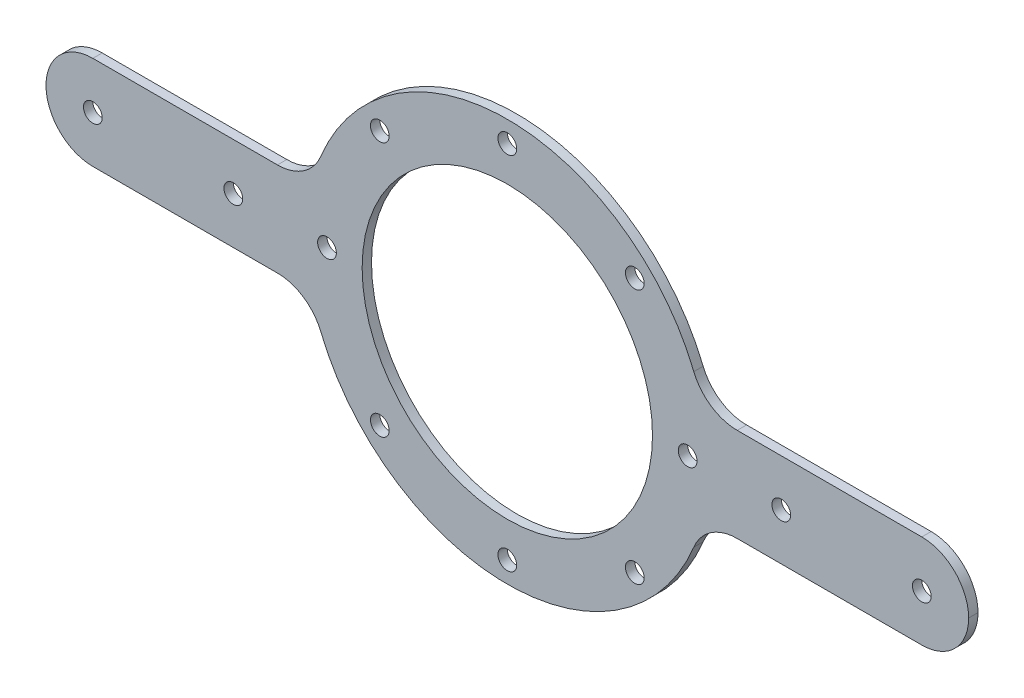
ISO-10303-21;
HEADER;
FILE_DESCRIPTION(('STEP AP214'),'2;1');
FILE_NAME('part.step','',(''),(''),'','','');
FILE_SCHEMA(('AUTOMOTIVE_DESIGN { 1 0 10303 214 1 1 1 1 }'));
ENDSEC;
DATA;
#1=APPLICATION_CONTEXT('core data for automotive mechanical design processes');
#2=APPLICATION_PROTOCOL_DEFINITION('international standard','automotive_design',2000,#1);
#3=PRODUCT_CONTEXT('',#1,'mechanical');
#4=PRODUCT('Part','Part','',(#3));
#5=PRODUCT_RELATED_PRODUCT_CATEGORY('part','',(#4));
#6=PRODUCT_DEFINITION_FORMATION('','',#4);
#7=PRODUCT_DEFINITION_CONTEXT('part definition',#1,'design');
#8=PRODUCT_DEFINITION('design','',#6,#7);
#9=PRODUCT_DEFINITION_SHAPE('','',#8);
#10=(LENGTH_UNIT() NAMED_UNIT(*) SI_UNIT(.MILLI.,.METRE.));
#11=(NAMED_UNIT(*) PLANE_ANGLE_UNIT() SI_UNIT($,.RADIAN.));
#12=(NAMED_UNIT(*) SI_UNIT($,.STERADIAN.) SOLID_ANGLE_UNIT());
#13=UNCERTAINTY_MEASURE_WITH_UNIT(LENGTH_MEASURE(1.E-05),#10,'distance_accuracy_value','');
#14=(GEOMETRIC_REPRESENTATION_CONTEXT(3) GLOBAL_UNCERTAINTY_ASSIGNED_CONTEXT((#13)) GLOBAL_UNIT_ASSIGNED_CONTEXT((#10,
#11,#12)) REPRESENTATION_CONTEXT('',''));
#15=CARTESIAN_POINT('',(0.,0.,0.));
#16=DIRECTION('',(0.,0.,1.));
#17=DIRECTION('',(1.,0.,0.));
#18=AXIS2_PLACEMENT_3D('',#15,#16,#17);
#19=CARTESIAN_POINT('',(0.,0.,1.));
#20=DIRECTION('',(0.,0.,1.));
#21=DIRECTION('',(1.,0.,0.));
#22=AXIS2_PLACEMENT_3D('',#19,#20,#21);
#23=PLANE('',#22);
#24=CARTESIAN_POINT('',(58.5,0.,1.));
#25=DIRECTION('',(0.,0.,1.));
#26=DIRECTION('',(1.,0.,0.));
#27=AXIS2_PLACEMENT_3D('',#24,#25,#26);
#28=CIRCLE('',#27,2.);
#29=CARTESIAN_POINT('',(60.5,0.,1.));
#30=VERTEX_POINT('',#29);
#31=EDGE_CURVE('E680',#30,#30,#28,.T.);
#32=ORIENTED_EDGE('',*,*,#31,.F.);
#33=EDGE_LOOP('',(#32));
#34=FACE_BOUND('',#33,.T.);
#35=CARTESIAN_POINT('',(-27.2236110756821,27.2236110756821,1.));
#36=DIRECTION('',(0.,0.,1.));
#37=DIRECTION('',(1.,0.,0.));
#38=AXIS2_PLACEMENT_3D('',#35,#36,#37);
#39=CIRCLE('',#38,2.00000000000001);
#40=CARTESIAN_POINT('',(-25.2236110756821,27.2236110756821,1.));
#41=VERTEX_POINT('',#40);
#42=EDGE_CURVE('E695',#41,#41,#39,.T.);
#43=ORIENTED_EDGE('',*,*,#42,.F.);
#44=EDGE_LOOP('',(#43));
#45=FACE_BOUND('',#44,.T.);
#46=CARTESIAN_POINT('',(-27.2236110756821,-27.2236110756821,1.));
#47=DIRECTION('',(0.,0.,1.));
#48=DIRECTION('',(1.,0.,0.));
#49=AXIS2_PLACEMENT_3D('',#46,#47,#48);
#50=CIRCLE('',#49,2.00000000000001);
#51=CARTESIAN_POINT('',(-25.2236110756821,-27.2236110756821,1.));
#52=VERTEX_POINT('',#51);
#53=EDGE_CURVE('E711',#52,#52,#50,.T.);
#54=ORIENTED_EDGE('',*,*,#53,.F.);
#55=EDGE_LOOP('',(#54));
#56=FACE_BOUND('',#55,.T.);
#57=CARTESIAN_POINT('',(27.2236110756821,-27.2236110756821,1.));
#58=DIRECTION('',(0.,0.,1.));
#59=DIRECTION('',(1.,0.,0.));
#60=AXIS2_PLACEMENT_3D('',#57,#58,#59);
#61=CIRCLE('',#60,2.);
#62=CARTESIAN_POINT('',(29.2236110756821,-27.2236110756821,1.));
#63=VERTEX_POINT('',#62);
#64=EDGE_CURVE('E727',#63,#63,#61,.T.);
#65=ORIENTED_EDGE('',*,*,#64,.F.);
#66=EDGE_LOOP('',(#65));
#67=FACE_BOUND('',#66,.T.);
#68=CARTESIAN_POINT('',(27.2236110756821,27.2236110756821,1.));
#69=DIRECTION('',(0.,0.,1.));
#70=DIRECTION('',(1.,0.,0.));
#71=AXIS2_PLACEMENT_3D('',#68,#69,#70);
#72=CIRCLE('',#71,2.);
#73=CARTESIAN_POINT('',(29.2236110756821,27.2236110756821,1.));
#74=VERTEX_POINT('',#73);
#75=EDGE_CURVE('E743',#74,#74,#72,.T.);
#76=ORIENTED_EDGE('',*,*,#75,.F.);
#77=EDGE_LOOP('',(#76));
#78=FACE_BOUND('',#77,.T.);
#79=CARTESIAN_POINT('',(-58.5,0.,1.));
#80=DIRECTION('',(0.,0.,1.));
#81=DIRECTION('',(1.,0.,0.));
#82=AXIS2_PLACEMENT_3D('',#79,#80,#81);
#83=CIRCLE('',#82,2.);
#84=CARTESIAN_POINT('',(-56.5,0.,1.));
#85=VERTEX_POINT('',#84);
#86=EDGE_CURVE('E759',#85,#85,#83,.T.);
#87=ORIENTED_EDGE('',*,*,#86,.F.);
#88=EDGE_LOOP('',(#87));
#89=FACE_BOUND('',#88,.T.);
#90=DIRECTION('',(1.,0.,0.));
#91=VECTOR('',#90,1.);
#92=CARTESIAN_POINT('',(98.5,-9.99999999999993,1.));
#93=LINE('',#92,#91);
#94=CARTESIAN_POINT('',(49.0815647672321,-10.,1.));
#95=VERTEX_POINT('',#94);
#96=CARTESIAN_POINT('',(88.5,-9.99999999999995,1.));
#97=VERTEX_POINT('',#96);
#98=EDGE_CURVE('E321',#95,#97,#93,.T.);
#99=ORIENTED_EDGE('',*,*,#98,.T.);
#100=CARTESIAN_POINT('',(88.5,0.,1.));
#101=DIRECTION('',(0.,0.,1.));
#102=DIRECTION('',(1.,0.,0.));
#103=AXIS2_PLACEMENT_3D('',#100,#101,#102);
#104=CIRCLE('',#103,10.);
#105=CARTESIAN_POINT('',(98.5,0.,1.));
#106=VERTEX_POINT('',#105);
#107=EDGE_CURVE('E230',#97,#106,#104,.T.);
#108=ORIENTED_EDGE('',*,*,#107,.T.);
#109=CARTESIAN_POINT('',(88.5,0.,1.));
#110=DIRECTION('',(0.,0.,1.));
#111=DIRECTION('',(1.,0.,0.));
#112=AXIS2_PLACEMENT_3D('',#109,#110,#111);
#113=CIRCLE('',#112,10.);
#114=CARTESIAN_POINT('',(88.5,10.,1.));
#115=VERTEX_POINT('',#114);
#116=EDGE_CURVE('E67',#106,#115,#113,.T.);
#117=ORIENTED_EDGE('',*,*,#116,.T.);
#118=DIRECTION('',(-1.,0.,0.));
#119=VECTOR('',#118,1.);
#120=CARTESIAN_POINT('',(41.821047332653,10.0000000000001,1.));
#121=LINE('',#120,#119);
#122=CARTESIAN_POINT('',(49.0815647672321,10.0000000000001,1.));
#123=VERTEX_POINT('',#122);
#124=EDGE_CURVE('E185',#115,#123,#121,.T.);
#125=ORIENTED_EDGE('',*,*,#124,.T.);
#126=CARTESIAN_POINT('',(49.0815647672321,20.0000000000001,1.));
#127=DIRECTION('',(0.,0.,1.));
#128=DIRECTION('',(1.,0.,0.));
#129=AXIS2_PLACEMENT_3D('',#126,#127,#128);
#130=CIRCLE('',#129,10.);
#131=CARTESIAN_POINT('',(39.8208921696411,16.2264150943397,1.));
#132=VERTEX_POINT('',#131);
#133=EDGE_CURVE('E154',#123,#132,#130,.F.);
#134=ORIENTED_EDGE('',*,*,#133,.T.);
#135=CARTESIAN_POINT('',(0.,0.,1.));
#136=DIRECTION('',(0.,0.,1.));
#137=DIRECTION('',(1.,0.,0.));
#138=AXIS2_PLACEMENT_3D('',#135,#136,#137);
#139=CIRCLE('',#138,43.);
#140=CARTESIAN_POINT('',(-39.8208921696411,16.2264150943396,1.));
#141=VERTEX_POINT('',#140);
#142=EDGE_CURVE('E164',#132,#141,#139,.T.);
#143=ORIENTED_EDGE('',*,*,#142,.T.);
#144=CARTESIAN_POINT('',(-49.0815647672321,20.,1.));
#145=DIRECTION('',(0.,0.,1.));
#146=DIRECTION('',(1.,0.,0.));
#147=AXIS2_PLACEMENT_3D('',#144,#145,#146);
#148=CIRCLE('',#147,10.);
#149=CARTESIAN_POINT('',(-49.0815647672321,10.,1.));
#150=VERTEX_POINT('',#149);
#151=EDGE_CURVE('E11',#141,#150,#148,.F.);
#152=ORIENTED_EDGE('',*,*,#151,.T.);
#153=DIRECTION('',(-1.,0.,0.));
#154=VECTOR('',#153,1.);
#155=CARTESIAN_POINT('',(-41.821047332653,10.,1.));
#156=LINE('',#155,#154);
#157=CARTESIAN_POINT('',(-88.5,9.99999999999998,1.));
#158=VERTEX_POINT('',#157);
#159=EDGE_CURVE('E303',#150,#158,#156,.T.);
#160=ORIENTED_EDGE('',*,*,#159,.T.);
#161=CARTESIAN_POINT('',(-88.5,0.,1.));
#162=DIRECTION('',(0.,0.,1.));
#163=DIRECTION('',(1.,0.,0.));
#164=AXIS2_PLACEMENT_3D('',#161,#162,#163);
#165=CIRCLE('',#164,10.);
#166=CARTESIAN_POINT('',(-98.5,0.,1.));
#167=VERTEX_POINT('',#166);
#168=EDGE_CURVE('E222',#158,#167,#165,.T.);
#169=ORIENTED_EDGE('',*,*,#168,.T.);
#170=CARTESIAN_POINT('',(-88.5,0.,1.));
#171=DIRECTION('',(0.,0.,1.));
#172=DIRECTION('',(1.,0.,0.));
#173=AXIS2_PLACEMENT_3D('',#170,#171,#172);
#174=CIRCLE('',#173,10.);
#175=CARTESIAN_POINT('',(-88.5,-10.,1.));
#176=VERTEX_POINT('',#175);
#177=EDGE_CURVE('E225',#167,#176,#174,.T.);
#178=ORIENTED_EDGE('',*,*,#177,.T.);
#179=DIRECTION('',(1.,0.,0.));
#180=VECTOR('',#179,1.);
#181=CARTESIAN_POINT('',(-98.5,-10.,1.));
#182=LINE('',#181,#180);
#183=CARTESIAN_POINT('',(-49.0815647672321,-10.,1.));
#184=VERTEX_POINT('',#183);
#185=EDGE_CURVE('E311',#176,#184,#182,.T.);
#186=ORIENTED_EDGE('',*,*,#185,.T.);
#187=CARTESIAN_POINT('',(-49.0815647672321,-20.,1.));
#188=DIRECTION('',(0.,0.,1.));
#189=DIRECTION('',(1.,0.,0.));
#190=AXIS2_PLACEMENT_3D('',#187,#188,#189);
#191=CIRCLE('',#190,10.);
#192=CARTESIAN_POINT('',(-39.8208921696411,-16.2264150943396,1.));
#193=VERTEX_POINT('',#192);
#194=EDGE_CURVE('E270',#184,#193,#191,.F.);
#195=ORIENTED_EDGE('',*,*,#194,.T.);
#196=CARTESIAN_POINT('',(0.,0.,1.));
#197=DIRECTION('',(0.,0.,1.));
#198=DIRECTION('',(1.,0.,0.));
#199=AXIS2_PLACEMENT_3D('',#196,#197,#198);
#200=CIRCLE('',#199,43.);
#201=CARTESIAN_POINT('',(39.8208921696411,-16.2264150943396,1.));
#202=VERTEX_POINT('',#201);
#203=EDGE_CURVE('E318',#193,#202,#200,.T.);
#204=ORIENTED_EDGE('',*,*,#203,.T.);
#205=CARTESIAN_POINT('',(49.0815647672321,-20.,1.));
#206=DIRECTION('',(0.,0.,1.));
#207=DIRECTION('',(1.,0.,0.));
#208=AXIS2_PLACEMENT_3D('',#205,#206,#207);
#209=CIRCLE('',#208,10.);
#210=EDGE_CURVE('E155',#202,#95,#209,.F.);
#211=ORIENTED_EDGE('',*,*,#210,.T.);
#212=EDGE_LOOP('',(#99,#108,#117,#125,#134,#143,#152,#160,#169,#178,#186,#195,#204,#211));
#213=FACE_BOUND('',#212,.T.);
#214=CARTESIAN_POINT('',(0.,0.,1.));
#215=DIRECTION('',(0.,0.,1.));
#216=DIRECTION('',(1.,0.,0.));
#217=AXIS2_PLACEMENT_3D('',#214,#215,#216);
#218=CIRCLE('',#217,31.);
#219=CARTESIAN_POINT('',(31.,0.,1.));
#220=VERTEX_POINT('',#219);
#221=EDGE_CURVE('E174',#220,#220,#218,.T.);
#222=ORIENTED_EDGE('',*,*,#221,.F.);
#223=EDGE_LOOP('',(#222));
#224=FACE_BOUND('',#223,.T.);
#225=CARTESIAN_POINT('',(0.,38.5,1.));
#226=DIRECTION('',(0.,0.,1.));
#227=DIRECTION('',(1.,0.,0.));
#228=AXIS2_PLACEMENT_3D('',#225,#226,#227);
#229=CIRCLE('',#228,2.);
#230=CARTESIAN_POINT('',(2.,38.5,1.));
#231=VERTEX_POINT('',#230);
#232=EDGE_CURVE('E751',#231,#231,#229,.T.);
#233=ORIENTED_EDGE('',*,*,#232,.F.);
#234=EDGE_LOOP('',(#233));
#235=FACE_BOUND('',#234,.T.);
#236=CARTESIAN_POINT('',(38.5,0.,1.));
#237=DIRECTION('',(0.,0.,1.));
#238=DIRECTION('',(1.,0.,0.));
#239=AXIS2_PLACEMENT_3D('',#236,#237,#238);
#240=CIRCLE('',#239,2.);
#241=CARTESIAN_POINT('',(40.5,0.,1.));
#242=VERTEX_POINT('',#241);
#243=EDGE_CURVE('E735',#242,#242,#240,.T.);
#244=ORIENTED_EDGE('',*,*,#243,.F.);
#245=EDGE_LOOP('',(#244));
#246=FACE_BOUND('',#245,.T.);
#247=CARTESIAN_POINT('',(0.,-38.5,1.));
#248=DIRECTION('',(0.,0.,1.));
#249=DIRECTION('',(1.,0.,0.));
#250=AXIS2_PLACEMENT_3D('',#247,#248,#249);
#251=CIRCLE('',#250,2.);
#252=CARTESIAN_POINT('',(2.00000000000001,-38.5,1.));
#253=VERTEX_POINT('',#252);
#254=EDGE_CURVE('E719',#253,#253,#251,.T.);
#255=ORIENTED_EDGE('',*,*,#254,.F.);
#256=EDGE_LOOP('',(#255));
#257=FACE_BOUND('',#256,.T.);
#258=CARTESIAN_POINT('',(-38.5,0.,1.));
#259=DIRECTION('',(0.,0.,1.));
#260=DIRECTION('',(1.,0.,0.));
#261=AXIS2_PLACEMENT_3D('',#258,#259,#260);
#262=CIRCLE('',#261,2.);
#263=CARTESIAN_POINT('',(-36.5,0.,1.));
#264=VERTEX_POINT('',#263);
#265=EDGE_CURVE('E703',#264,#264,#262,.T.);
#266=ORIENTED_EDGE('',*,*,#265,.F.);
#267=EDGE_LOOP('',(#266));
#268=FACE_BOUND('',#267,.T.);
#269=CARTESIAN_POINT('',(-88.5,0.,1.));
#270=DIRECTION('',(0.,0.,1.));
#271=DIRECTION('',(1.,0.,0.));
#272=AXIS2_PLACEMENT_3D('',#269,#270,#271);
#273=CIRCLE('',#272,2.);
#274=CARTESIAN_POINT('',(-86.5,0.,1.));
#275=VERTEX_POINT('',#274);
#276=EDGE_CURVE('E687',#275,#275,#273,.T.);
#277=ORIENTED_EDGE('',*,*,#276,.F.);
#278=EDGE_LOOP('',(#277));
#279=FACE_BOUND('',#278,.T.);
#280=CARTESIAN_POINT('',(88.5,0.,1.));
#281=DIRECTION('',(0.,0.,1.));
#282=DIRECTION('',(1.,0.,0.));
#283=AXIS2_PLACEMENT_3D('',#280,#281,#282);
#284=CIRCLE('',#283,2.);
#285=CARTESIAN_POINT('',(90.5,0.,1.));
#286=VERTEX_POINT('',#285);
#287=EDGE_CURVE('E284',#286,#286,#284,.T.);
#288=ORIENTED_EDGE('',*,*,#287,.F.);
#289=EDGE_LOOP('',(#288));
#290=FACE_BOUND('',#289,.T.);
#291=ADVANCED_FACE('F42',(#34,#45,#56,#67,#78,#89,#213,#224,#235,#246,#257,#268,#279,#290),#23,.T.);
#292=CARTESIAN_POINT('',(0.,0.,-1.));
#293=DIRECTION('',(0.,0.,1.));
#294=DIRECTION('',(1.,0.,0.));
#295=AXIS2_PLACEMENT_3D('',#292,#293,#294);
#296=PLANE('',#295);
#297=CARTESIAN_POINT('',(88.5,0.,-1.));
#298=DIRECTION('',(0.,0.,1.));
#299=DIRECTION('',(1.,0.,0.));
#300=AXIS2_PLACEMENT_3D('',#297,#298,#299);
#301=CIRCLE('',#300,10.);
#302=CARTESIAN_POINT('',(88.5,10.,-1.));
#303=VERTEX_POINT('',#302);
#304=CARTESIAN_POINT('',(98.5,0.,-1.));
#305=VERTEX_POINT('',#304);
#306=EDGE_CURVE('E208',#303,#305,#301,.F.);
#307=ORIENTED_EDGE('',*,*,#306,.T.);
#308=CARTESIAN_POINT('',(88.5,0.,-1.));
#309=DIRECTION('',(0.,0.,1.));
#310=DIRECTION('',(1.,0.,0.));
#311=AXIS2_PLACEMENT_3D('',#308,#309,#310);
#312=CIRCLE('',#311,10.);
#313=CARTESIAN_POINT('',(88.5,-9.99999999999995,-1.));
#314=VERTEX_POINT('',#313);
#315=EDGE_CURVE('E211',#305,#314,#312,.F.);
#316=ORIENTED_EDGE('',*,*,#315,.T.);
#317=DIRECTION('',(1.,0.,0.));
#318=VECTOR('',#317,1.);
#319=CARTESIAN_POINT('',(98.5,-9.99999999999993,-1.));
#320=LINE('',#319,#318);
#321=CARTESIAN_POINT('',(49.0815647672321,-10.,-1.));
#322=VERTEX_POINT('',#321);
#323=EDGE_CURVE('E195',#322,#314,#320,.T.);
#324=ORIENTED_EDGE('',*,*,#323,.F.);
#325=CARTESIAN_POINT('',(49.0815647672321,-20.,-1.));
#326=DIRECTION('',(0.,0.,1.));
#327=DIRECTION('',(1.,0.,0.));
#328=AXIS2_PLACEMENT_3D('',#325,#326,#327);
#329=CIRCLE('',#328,10.);
#330=CARTESIAN_POINT('',(39.8208921696411,-16.2264150943396,-1.));
#331=VERTEX_POINT('',#330);
#332=EDGE_CURVE('E260',#322,#331,#329,.T.);
#333=ORIENTED_EDGE('',*,*,#332,.T.);
#334=CARTESIAN_POINT('',(0.,0.,-1.));
#335=DIRECTION('',(0.,0.,1.));
#336=DIRECTION('',(1.,0.,0.));
#337=AXIS2_PLACEMENT_3D('',#334,#335,#336);
#338=CIRCLE('',#337,43.);
#339=CARTESIAN_POINT('',(-39.8208921696411,-16.2264150943396,-1.));
#340=VERTEX_POINT('',#339);
#341=EDGE_CURVE('E191',#340,#331,#338,.T.);
#342=ORIENTED_EDGE('',*,*,#341,.F.);
#343=CARTESIAN_POINT('',(-49.0815647672321,-20.,-1.));
#344=DIRECTION('',(0.,0.,1.));
#345=DIRECTION('',(1.,0.,0.));
#346=AXIS2_PLACEMENT_3D('',#343,#344,#345);
#347=CIRCLE('',#346,10.);
#348=CARTESIAN_POINT('',(-49.0815647672321,-10.,-1.));
#349=VERTEX_POINT('',#348);
#350=EDGE_CURVE('E267',#340,#349,#347,.T.);
#351=ORIENTED_EDGE('',*,*,#350,.T.);
#352=DIRECTION('',(1.,0.,0.));
#353=VECTOR('',#352,1.);
#354=CARTESIAN_POINT('',(-98.5,-10.,-1.));
#355=LINE('',#354,#353);
#356=CARTESIAN_POINT('',(-88.5,-10.,-1.));
#357=VERTEX_POINT('',#356);
#358=EDGE_CURVE('E179',#357,#349,#355,.T.);
#359=ORIENTED_EDGE('',*,*,#358,.F.);
#360=CARTESIAN_POINT('',(-88.5,0.,-1.));
#361=DIRECTION('',(0.,0.,1.));
#362=DIRECTION('',(1.,0.,0.));
#363=AXIS2_PLACEMENT_3D('',#360,#361,#362);
#364=CIRCLE('',#363,10.);
#365=CARTESIAN_POINT('',(-98.5,0.,-1.));
#366=VERTEX_POINT('',#365);
#367=EDGE_CURVE('E205',#357,#366,#364,.F.);
#368=ORIENTED_EDGE('',*,*,#367,.T.);
#369=CARTESIAN_POINT('',(-88.5,0.,-1.));
#370=DIRECTION('',(0.,0.,1.));
#371=DIRECTION('',(1.,0.,0.));
#372=AXIS2_PLACEMENT_3D('',#369,#370,#371);
#373=CIRCLE('',#372,10.);
#374=CARTESIAN_POINT('',(-88.5,9.99999999999998,-1.));
#375=VERTEX_POINT('',#374);
#376=EDGE_CURVE('E202',#366,#375,#373,.F.);
#377=ORIENTED_EDGE('',*,*,#376,.T.);
#378=DIRECTION('',(-1.,0.,0.));
#379=VECTOR('',#378,1.);
#380=CARTESIAN_POINT('',(-41.821047332653,10.,-1.));
#381=LINE('',#380,#379);
#382=CARTESIAN_POINT('',(-49.0815647672321,10.,-1.));
#383=VERTEX_POINT('',#382);
#384=EDGE_CURVE('E173',#383,#375,#381,.T.);
#385=ORIENTED_EDGE('',*,*,#384,.F.);
#386=CARTESIAN_POINT('',(-49.0815647672321,20.,-1.));
#387=DIRECTION('',(0.,0.,1.));
#388=DIRECTION('',(1.,0.,0.));
#389=AXIS2_PLACEMENT_3D('',#386,#387,#388);
#390=CIRCLE('',#389,10.);
#391=CARTESIAN_POINT('',(-39.8208921696411,16.2264150943396,-1.));
#392=VERTEX_POINT('',#391);
#393=EDGE_CURVE('E52',#383,#392,#390,.T.);
#394=ORIENTED_EDGE('',*,*,#393,.T.);
#395=CARTESIAN_POINT('',(0.,0.,-1.));
#396=DIRECTION('',(0.,0.,1.));
#397=DIRECTION('',(1.,0.,0.));
#398=AXIS2_PLACEMENT_3D('',#395,#396,#397);
#399=CIRCLE('',#398,43.);
#400=CARTESIAN_POINT('',(39.8208921696411,16.2264150943397,-1.));
#401=VERTEX_POINT('',#400);
#402=EDGE_CURVE('E161',#401,#392,#399,.T.);
#403=ORIENTED_EDGE('',*,*,#402,.F.);
#404=CARTESIAN_POINT('',(49.0815647672321,20.0000000000001,-1.));
#405=DIRECTION('',(0.,0.,1.));
#406=DIRECTION('',(1.,0.,0.));
#407=AXIS2_PLACEMENT_3D('',#404,#405,#406);
#408=CIRCLE('',#407,10.);
#409=CARTESIAN_POINT('',(49.0815647672321,10.0000000000001,-1.));
#410=VERTEX_POINT('',#409);
#411=EDGE_CURVE('E145',#401,#410,#408,.T.);
#412=ORIENTED_EDGE('',*,*,#411,.T.);
#413=DIRECTION('',(-1.,0.,0.));
#414=VECTOR('',#413,1.);
#415=CARTESIAN_POINT('',(41.821047332653,10.0000000000001,-1.));
#416=LINE('',#415,#414);
#417=EDGE_CURVE('E199',#303,#410,#416,.T.);
#418=ORIENTED_EDGE('',*,*,#417,.F.);
#419=EDGE_LOOP('',(#307,#316,#324,#333,#342,#351,#359,#368,#377,#385,#394,#403,#412,#418));
#420=FACE_BOUND('',#419,.T.);
#421=CARTESIAN_POINT('',(0.,0.,-1.));
#422=DIRECTION('',(0.,0.,1.));
#423=DIRECTION('',(1.,0.,0.));
#424=AXIS2_PLACEMENT_3D('',#421,#422,#423);
#425=CIRCLE('',#424,31.);
#426=CARTESIAN_POINT('',(31.,0.,-1.));
#427=VERTEX_POINT('',#426);
#428=EDGE_CURVE('E182',#427,#427,#425,.T.);
#429=ORIENTED_EDGE('',*,*,#428,.T.);
#430=EDGE_LOOP('',(#429));
#431=FACE_BOUND('',#430,.T.);
#432=CARTESIAN_POINT('',(-58.5,0.,-1.));
#433=DIRECTION('',(0.,0.,1.));
#434=DIRECTION('',(1.,0.,0.));
#435=AXIS2_PLACEMENT_3D('',#432,#433,#434);
#436=CIRCLE('',#435,2.);
#437=CARTESIAN_POINT('',(-56.5,0.,-1.));
#438=VERTEX_POINT('',#437);
#439=EDGE_CURVE('E755',#438,#438,#436,.T.);
#440=ORIENTED_EDGE('',*,*,#439,.T.);
#441=EDGE_LOOP('',(#440));
#442=FACE_BOUND('',#441,.T.);
#443=CARTESIAN_POINT('',(0.,38.5,-1.));
#444=DIRECTION('',(0.,0.,1.));
#445=DIRECTION('',(1.,0.,0.));
#446=AXIS2_PLACEMENT_3D('',#443,#444,#445);
#447=CIRCLE('',#446,2.);
#448=CARTESIAN_POINT('',(2.,38.5,-1.));
#449=VERTEX_POINT('',#448);
#450=EDGE_CURVE('E747',#449,#449,#447,.T.);
#451=ORIENTED_EDGE('',*,*,#450,.T.);
#452=EDGE_LOOP('',(#451));
#453=FACE_BOUND('',#452,.T.);
#454=CARTESIAN_POINT('',(27.2236110756821,27.2236110756821,-1.));
#455=DIRECTION('',(0.,0.,1.));
#456=DIRECTION('',(1.,0.,0.));
#457=AXIS2_PLACEMENT_3D('',#454,#455,#456);
#458=CIRCLE('',#457,2.);
#459=CARTESIAN_POINT('',(29.2236110756821,27.2236110756821,-1.));
#460=VERTEX_POINT('',#459);
#461=EDGE_CURVE('E739',#460,#460,#458,.T.);
#462=ORIENTED_EDGE('',*,*,#461,.T.);
#463=EDGE_LOOP('',(#462));
#464=FACE_BOUND('',#463,.T.);
#465=CARTESIAN_POINT('',(38.5,0.,-1.));
#466=DIRECTION('',(0.,0.,1.));
#467=DIRECTION('',(1.,0.,0.));
#468=AXIS2_PLACEMENT_3D('',#465,#466,#467);
#469=CIRCLE('',#468,2.);
#470=CARTESIAN_POINT('',(40.5,0.,-1.));
#471=VERTEX_POINT('',#470);
#472=EDGE_CURVE('E731',#471,#471,#469,.T.);
#473=ORIENTED_EDGE('',*,*,#472,.T.);
#474=EDGE_LOOP('',(#473));
#475=FACE_BOUND('',#474,.T.);
#476=CARTESIAN_POINT('',(27.2236110756821,-27.2236110756821,-1.));
#477=DIRECTION('',(0.,0.,1.));
#478=DIRECTION('',(1.,0.,0.));
#479=AXIS2_PLACEMENT_3D('',#476,#477,#478);
#480=CIRCLE('',#479,2.);
#481=CARTESIAN_POINT('',(29.2236110756821,-27.2236110756821,-1.));
#482=VERTEX_POINT('',#481);
#483=EDGE_CURVE('E723',#482,#482,#480,.T.);
#484=ORIENTED_EDGE('',*,*,#483,.T.);
#485=EDGE_LOOP('',(#484));
#486=FACE_BOUND('',#485,.T.);
#487=CARTESIAN_POINT('',(0.,-38.5,-1.));
#488=DIRECTION('',(0.,0.,1.));
#489=DIRECTION('',(1.,0.,0.));
#490=AXIS2_PLACEMENT_3D('',#487,#488,#489);
#491=CIRCLE('',#490,2.);
#492=CARTESIAN_POINT('',(2.00000000000001,-38.5,-1.));
#493=VERTEX_POINT('',#492);
#494=EDGE_CURVE('E715',#493,#493,#491,.T.);
#495=ORIENTED_EDGE('',*,*,#494,.T.);
#496=EDGE_LOOP('',(#495));
#497=FACE_BOUND('',#496,.T.);
#498=CARTESIAN_POINT('',(-27.2236110756821,-27.2236110756821,-1.));
#499=DIRECTION('',(0.,0.,1.));
#500=DIRECTION('',(1.,0.,0.));
#501=AXIS2_PLACEMENT_3D('',#498,#499,#500);
#502=CIRCLE('',#501,2.00000000000001);
#503=CARTESIAN_POINT('',(-25.2236110756821,-27.2236110756821,-1.));
#504=VERTEX_POINT('',#503);
#505=EDGE_CURVE('E707',#504,#504,#502,.T.);
#506=ORIENTED_EDGE('',*,*,#505,.T.);
#507=EDGE_LOOP('',(#506));
#508=FACE_BOUND('',#507,.T.);
#509=CARTESIAN_POINT('',(-38.5,0.,-1.));
#510=DIRECTION('',(0.,0.,1.));
#511=DIRECTION('',(1.,0.,0.));
#512=AXIS2_PLACEMENT_3D('',#509,#510,#511);
#513=CIRCLE('',#512,2.);
#514=CARTESIAN_POINT('',(-36.5,0.,-1.));
#515=VERTEX_POINT('',#514);
#516=EDGE_CURVE('E699',#515,#515,#513,.T.);
#517=ORIENTED_EDGE('',*,*,#516,.T.);
#518=EDGE_LOOP('',(#517));
#519=FACE_BOUND('',#518,.T.);
#520=CARTESIAN_POINT('',(-27.2236110756821,27.2236110756821,-1.));
#521=DIRECTION('',(0.,0.,1.));
#522=DIRECTION('',(1.,0.,0.));
#523=AXIS2_PLACEMENT_3D('',#520,#521,#522);
#524=CIRCLE('',#523,2.00000000000001);
#525=CARTESIAN_POINT('',(-25.2236110756821,27.2236110756821,-1.));
#526=VERTEX_POINT('',#525);
#527=EDGE_CURVE('E691',#526,#526,#524,.T.);
#528=ORIENTED_EDGE('',*,*,#527,.T.);
#529=EDGE_LOOP('',(#528));
#530=FACE_BOUND('',#529,.T.);
#531=CARTESIAN_POINT('',(-88.5,0.,-1.));
#532=DIRECTION('',(0.,0.,1.));
#533=DIRECTION('',(1.,0.,0.));
#534=AXIS2_PLACEMENT_3D('',#531,#532,#533);
#535=CIRCLE('',#534,2.);
#536=CARTESIAN_POINT('',(-86.5,0.,-1.));
#537=VERTEX_POINT('',#536);
#538=EDGE_CURVE('E685',#537,#537,#535,.T.);
#539=ORIENTED_EDGE('',*,*,#538,.T.);
#540=EDGE_LOOP('',(#539));
#541=FACE_BOUND('',#540,.T.);
#542=CARTESIAN_POINT('',(58.5,0.,-1.));
#543=DIRECTION('',(0.,0.,1.));
#544=DIRECTION('',(1.,0.,0.));
#545=AXIS2_PLACEMENT_3D('',#542,#543,#544);
#546=CIRCLE('',#545,2.);
#547=CARTESIAN_POINT('',(60.5,0.,-1.));
#548=VERTEX_POINT('',#547);
#549=EDGE_CURVE('E676',#548,#548,#546,.T.);
#550=ORIENTED_EDGE('',*,*,#549,.T.);
#551=EDGE_LOOP('',(#550));
#552=FACE_BOUND('',#551,.T.);
#553=CARTESIAN_POINT('',(88.5,0.,-1.));
#554=DIRECTION('',(0.,0.,1.));
#555=DIRECTION('',(1.,0.,0.));
#556=AXIS2_PLACEMENT_3D('',#553,#554,#555);
#557=CIRCLE('',#556,2.);
#558=CARTESIAN_POINT('',(90.5,0.,-1.));
#559=VERTEX_POINT('',#558);
#560=EDGE_CURVE('E277',#559,#559,#557,.T.);
#561=ORIENTED_EDGE('',*,*,#560,.T.);
#562=EDGE_LOOP('',(#561));
#563=FACE_BOUND('',#562,.T.);
#564=ADVANCED_FACE('F169',(#420,#431,#442,#453,#464,#475,#486,#497,#508,#519,#530,#541,#552,
#563),#296,.F.);
#565=CARTESIAN_POINT('',(0.,0.,1.));
#566=DIRECTION('',(0.,0.,-1.));
#567=DIRECTION('',(-1.,0.,0.));
#568=AXIS2_PLACEMENT_3D('',#565,#566,#567);
#569=CYLINDRICAL_SURFACE('',#568,43.);
#570=ORIENTED_EDGE('',*,*,#142,.F.);
#571=DIRECTION('',(0.,0.,-1.));
#572=VECTOR('',#571,1.);
#573=CARTESIAN_POINT('',(39.8208921696411,16.2264150943397,1.));
#574=LINE('',#573,#572);
#575=EDGE_CURVE('E149',#132,#401,#574,.T.);
#576=ORIENTED_EDGE('',*,*,#575,.T.);
#577=ORIENTED_EDGE('',*,*,#402,.T.);
#578=DIRECTION('',(0.,0.,-1.));
#579=VECTOR('',#578,1.);
#580=CARTESIAN_POINT('',(-39.8208921696412,16.2264150943396,1.));
#581=LINE('',#580,#579);
#582=EDGE_CURVE('E167',#392,#141,#581,.F.);
#583=ORIENTED_EDGE('',*,*,#582,.T.);
#584=EDGE_LOOP('',(#570,#576,#577,#583));
#585=FACE_BOUND('',#584,.T.);
#586=ADVANCED_FACE('F160',(#585),#569,.T.);
#587=CARTESIAN_POINT('',(-41.821047332653,10.,1.));
#588=DIRECTION('',(0.,-1.,0.));
#589=DIRECTION('',(1.,0.,0.));
#590=AXIS2_PLACEMENT_3D('',#587,#588,#589);
#591=PLANE('',#590);
#592=ORIENTED_EDGE('',*,*,#384,.T.);
#593=DIRECTION('',(0.,0.,-1.));
#594=VECTOR('',#593,1.);
#595=CARTESIAN_POINT('',(-88.5,9.99999999999998,1.));
#596=LINE('',#595,#594);
#597=EDGE_CURVE('E257',#375,#158,#596,.F.);
#598=ORIENTED_EDGE('',*,*,#597,.T.);
#599=ORIENTED_EDGE('',*,*,#159,.F.);
#600=DIRECTION('',(0.,0.,1.));
#601=VECTOR('',#600,1.);
#602=CARTESIAN_POINT('',(-49.0815647672321,10.,-1.));
#603=LINE('',#602,#601);
#604=EDGE_CURVE('E253',#150,#383,#603,.F.);
#605=ORIENTED_EDGE('',*,*,#604,.T.);
#606=EDGE_LOOP('',(#592,#598,#599,#605));
#607=FACE_BOUND('',#606,.T.);
#608=ADVANCED_FACE('F299',(#607),#591,.F.);
#609=CARTESIAN_POINT('',(-98.5,-10.,1.));
#610=DIRECTION('',(0.,1.,0.));
#611=DIRECTION('',(-1.,0.,0.));
#612=AXIS2_PLACEMENT_3D('',#609,#610,#611);
#613=PLANE('',#612);
#614=ORIENTED_EDGE('',*,*,#358,.T.);
#615=DIRECTION('',(0.,0.,1.));
#616=VECTOR('',#615,1.);
#617=CARTESIAN_POINT('',(-49.0815647672321,-10.,1.));
#618=LINE('',#617,#616);
#619=EDGE_CURVE('E250',#349,#184,#618,.T.);
#620=ORIENTED_EDGE('',*,*,#619,.T.);
#621=ORIENTED_EDGE('',*,*,#185,.F.);
#622=DIRECTION('',(0.,0.,-1.));
#623=VECTOR('',#622,1.);
#624=CARTESIAN_POINT('',(-88.5,-10.,1.));
#625=LINE('',#624,#623);
#626=EDGE_CURVE('E166',#176,#357,#625,.T.);
#627=ORIENTED_EDGE('',*,*,#626,.T.);
#628=EDGE_LOOP('',(#614,#620,#621,#627));
#629=FACE_BOUND('',#628,.T.);
#630=ADVANCED_FACE('F368',(#629),#613,.F.);
#631=CARTESIAN_POINT('',(0.,0.,1.));
#632=DIRECTION('',(0.,0.,-1.));
#633=DIRECTION('',(-1.,0.,0.));
#634=AXIS2_PLACEMENT_3D('',#631,#632,#633);
#635=CYLINDRICAL_SURFACE('',#634,43.);
#636=ORIENTED_EDGE('',*,*,#341,.T.);
#637=DIRECTION('',(0.,0.,-1.));
#638=VECTOR('',#637,1.);
#639=CARTESIAN_POINT('',(39.8208921696411,-16.2264150943396,1.));
#640=LINE('',#639,#638);
#641=EDGE_CURVE('E242',#331,#202,#640,.F.);
#642=ORIENTED_EDGE('',*,*,#641,.T.);
#643=ORIENTED_EDGE('',*,*,#203,.F.);
#644=DIRECTION('',(0.,0.,-1.));
#645=VECTOR('',#644,1.);
#646=CARTESIAN_POINT('',(-39.8208921696411,-16.2264150943396,1.));
#647=LINE('',#646,#645);
#648=EDGE_CURVE('E238',#193,#340,#647,.T.);
#649=ORIENTED_EDGE('',*,*,#648,.T.);
#650=EDGE_LOOP('',(#636,#642,#643,#649));
#651=FACE_BOUND('',#650,.T.);
#652=ADVANCED_FACE('F365',(#651),#635,.T.);
#653=CARTESIAN_POINT('',(98.5,-9.99999999999993,1.));
#654=DIRECTION('',(0.,1.,0.));
#655=DIRECTION('',(-1.,0.,0.));
#656=AXIS2_PLACEMENT_3D('',#653,#654,#655);
#657=PLANE('',#656);
#658=ORIENTED_EDGE('',*,*,#323,.T.);
#659=DIRECTION('',(0.,0.,-1.));
#660=VECTOR('',#659,1.);
#661=CARTESIAN_POINT('',(88.5,-9.99999999999995,1.));
#662=LINE('',#661,#660);
#663=EDGE_CURVE('E218',#314,#97,#662,.F.);
#664=ORIENTED_EDGE('',*,*,#663,.T.);
#665=ORIENTED_EDGE('',*,*,#98,.F.);
#666=DIRECTION('',(0.,0.,1.));
#667=VECTOR('',#666,1.);
#668=CARTESIAN_POINT('',(49.0815647672321,-10.,-1.));
#669=LINE('',#668,#667);
#670=EDGE_CURVE('E214',#95,#322,#669,.F.);
#671=ORIENTED_EDGE('',*,*,#670,.T.);
#672=EDGE_LOOP('',(#658,#664,#665,#671));
#673=FACE_BOUND('',#672,.T.);
#674=ADVANCED_FACE('F333',(#673),#657,.F.);
#675=CARTESIAN_POINT('',(41.821047332653,10.0000000000001,1.));
#676=DIRECTION('',(0.,-1.,0.));
#677=DIRECTION('',(1.,0.,0.));
#678=AXIS2_PLACEMENT_3D('',#675,#676,#677);
#679=PLANE('',#678);
#680=ORIENTED_EDGE('',*,*,#124,.F.);
#681=DIRECTION('',(0.,0.,-1.));
#682=VECTOR('',#681,1.);
#683=CARTESIAN_POINT('',(88.5,10.,1.));
#684=LINE('',#683,#682);
#685=EDGE_CURVE('E235',#115,#303,#684,.T.);
#686=ORIENTED_EDGE('',*,*,#685,.T.);
#687=ORIENTED_EDGE('',*,*,#417,.T.);
#688=DIRECTION('',(0.,0.,1.));
#689=VECTOR('',#688,1.);
#690=CARTESIAN_POINT('',(49.0815647672321,10.0000000000001,1.));
#691=LINE('',#690,#689);
#692=EDGE_CURVE('E60',#410,#123,#691,.T.);
#693=ORIENTED_EDGE('',*,*,#692,.T.);
#694=EDGE_LOOP('',(#680,#686,#687,#693));
#695=FACE_BOUND('',#694,.T.);
#696=ADVANCED_FACE('F326',(#695),#679,.F.);
#697=CARTESIAN_POINT('',(0.,0.,1.));
#698=DIRECTION('',(0.,0.,-1.));
#699=DIRECTION('',(-1.,0.,0.));
#700=AXIS2_PLACEMENT_3D('',#697,#698,#699);
#701=CYLINDRICAL_SURFACE('',#700,31.);
#702=ORIENTED_EDGE('',*,*,#221,.T.);
#703=EDGE_LOOP('',(#702));
#704=FACE_BOUND('',#703,.T.);
#705=ORIENTED_EDGE('',*,*,#428,.F.);
#706=EDGE_LOOP('',(#705));
#707=FACE_BOUND('',#706,.T.);
#708=ADVANCED_FACE('F358',(#704,#707),#701,.F.);
#709=CARTESIAN_POINT('',(-58.5,0.,1.));
#710=DIRECTION('',(0.,0.,-1.));
#711=DIRECTION('',(-1.,0.,0.));
#712=AXIS2_PLACEMENT_3D('',#709,#710,#711);
#713=CYLINDRICAL_SURFACE('',#712,2.);
#714=ORIENTED_EDGE('',*,*,#86,.T.);
#715=EDGE_LOOP('',(#714));
#716=FACE_BOUND('',#715,.T.);
#717=ORIENTED_EDGE('',*,*,#439,.F.);
#718=EDGE_LOOP('',(#717));
#719=FACE_BOUND('',#718,.T.);
#720=ADVANCED_FACE('F406',(#716,#719),#713,.F.);
#721=CARTESIAN_POINT('',(0.,38.5,1.));
#722=DIRECTION('',(0.,0.,-1.));
#723=DIRECTION('',(-1.,0.,0.));
#724=AXIS2_PLACEMENT_3D('',#721,#722,#723);
#725=CYLINDRICAL_SURFACE('',#724,2.);
#726=ORIENTED_EDGE('',*,*,#232,.T.);
#727=EDGE_LOOP('',(#726));
#728=FACE_BOUND('',#727,.T.);
#729=ORIENTED_EDGE('',*,*,#450,.F.);
#730=EDGE_LOOP('',(#729));
#731=FACE_BOUND('',#730,.T.);
#732=ADVANCED_FACE('F413',(#728,#731),#725,.F.);
#733=CARTESIAN_POINT('',(27.2236110756821,27.2236110756821,1.));
#734=DIRECTION('',(0.,0.,-1.));
#735=DIRECTION('',(-1.,0.,0.));
#736=AXIS2_PLACEMENT_3D('',#733,#734,#735);
#737=CYLINDRICAL_SURFACE('',#736,2.);
#738=ORIENTED_EDGE('',*,*,#75,.T.);
#739=EDGE_LOOP('',(#738));
#740=FACE_BOUND('',#739,.T.);
#741=ORIENTED_EDGE('',*,*,#461,.F.);
#742=EDGE_LOOP('',(#741));
#743=FACE_BOUND('',#742,.T.);
#744=ADVANCED_FACE('F420',(#740,#743),#737,.F.);
#745=CARTESIAN_POINT('',(38.5,0.,1.));
#746=DIRECTION('',(0.,0.,-1.));
#747=DIRECTION('',(-1.,0.,0.));
#748=AXIS2_PLACEMENT_3D('',#745,#746,#747);
#749=CYLINDRICAL_SURFACE('',#748,2.);
#750=ORIENTED_EDGE('',*,*,#243,.T.);
#751=EDGE_LOOP('',(#750));
#752=FACE_BOUND('',#751,.T.);
#753=ORIENTED_EDGE('',*,*,#472,.F.);
#754=EDGE_LOOP('',(#753));
#755=FACE_BOUND('',#754,.T.);
#756=ADVANCED_FACE('F428',(#752,#755),#749,.F.);
#757=CARTESIAN_POINT('',(27.2236110756821,-27.2236110756821,1.));
#758=DIRECTION('',(0.,0.,-1.));
#759=DIRECTION('',(-1.,0.,0.));
#760=AXIS2_PLACEMENT_3D('',#757,#758,#759);
#761=CYLINDRICAL_SURFACE('',#760,2.);
#762=ORIENTED_EDGE('',*,*,#64,.T.);
#763=EDGE_LOOP('',(#762));
#764=FACE_BOUND('',#763,.T.);
#765=ORIENTED_EDGE('',*,*,#483,.F.);
#766=EDGE_LOOP('',(#765));
#767=FACE_BOUND('',#766,.T.);
#768=ADVANCED_FACE('F436',(#764,#767),#761,.F.);
#769=CARTESIAN_POINT('',(0.,-38.5,1.));
#770=DIRECTION('',(0.,0.,-1.));
#771=DIRECTION('',(-1.,0.,0.));
#772=AXIS2_PLACEMENT_3D('',#769,#770,#771);
#773=CYLINDRICAL_SURFACE('',#772,2.);
#774=ORIENTED_EDGE('',*,*,#254,.T.);
#775=EDGE_LOOP('',(#774));
#776=FACE_BOUND('',#775,.T.);
#777=ORIENTED_EDGE('',*,*,#494,.F.);
#778=EDGE_LOOP('',(#777));
#779=FACE_BOUND('',#778,.T.);
#780=ADVANCED_FACE('F444',(#776,#779),#773,.F.);
#781=CARTESIAN_POINT('',(-27.2236110756821,-27.2236110756821,1.));
#782=DIRECTION('',(0.,0.,-1.));
#783=DIRECTION('',(-1.,0.,0.));
#784=AXIS2_PLACEMENT_3D('',#781,#782,#783);
#785=CYLINDRICAL_SURFACE('',#784,2.00000000000001);
#786=ORIENTED_EDGE('',*,*,#53,.T.);
#787=EDGE_LOOP('',(#786));
#788=FACE_BOUND('',#787,.T.);
#789=ORIENTED_EDGE('',*,*,#505,.F.);
#790=EDGE_LOOP('',(#789));
#791=FACE_BOUND('',#790,.T.);
#792=ADVANCED_FACE('F452',(#788,#791),#785,.F.);
#793=CARTESIAN_POINT('',(-38.5,0.,1.));
#794=DIRECTION('',(0.,0.,-1.));
#795=DIRECTION('',(-1.,0.,0.));
#796=AXIS2_PLACEMENT_3D('',#793,#794,#795);
#797=CYLINDRICAL_SURFACE('',#796,2.);
#798=ORIENTED_EDGE('',*,*,#265,.T.);
#799=EDGE_LOOP('',(#798));
#800=FACE_BOUND('',#799,.T.);
#801=ORIENTED_EDGE('',*,*,#516,.F.);
#802=EDGE_LOOP('',(#801));
#803=FACE_BOUND('',#802,.T.);
#804=ADVANCED_FACE('F460',(#800,#803),#797,.F.);
#805=CARTESIAN_POINT('',(-27.2236110756821,27.2236110756821,1.));
#806=DIRECTION('',(0.,0.,-1.));
#807=DIRECTION('',(-1.,0.,0.));
#808=AXIS2_PLACEMENT_3D('',#805,#806,#807);
#809=CYLINDRICAL_SURFACE('',#808,2.00000000000001);
#810=ORIENTED_EDGE('',*,*,#42,.T.);
#811=EDGE_LOOP('',(#810));
#812=FACE_BOUND('',#811,.T.);
#813=ORIENTED_EDGE('',*,*,#527,.F.);
#814=EDGE_LOOP('',(#813));
#815=FACE_BOUND('',#814,.T.);
#816=ADVANCED_FACE('F468',(#812,#815),#809,.F.);
#817=CARTESIAN_POINT('',(-88.5,0.,1.));
#818=DIRECTION('',(0.,0.,-1.));
#819=DIRECTION('',(-1.,0.,0.));
#820=AXIS2_PLACEMENT_3D('',#817,#818,#819);
#821=CYLINDRICAL_SURFACE('',#820,2.);
#822=ORIENTED_EDGE('',*,*,#276,.T.);
#823=EDGE_LOOP('',(#822));
#824=FACE_BOUND('',#823,.T.);
#825=ORIENTED_EDGE('',*,*,#538,.F.);
#826=EDGE_LOOP('',(#825));
#827=FACE_BOUND('',#826,.T.);
#828=ADVANCED_FACE('F476',(#824,#827),#821,.F.);
#829=CARTESIAN_POINT('',(58.5,0.,1.));
#830=DIRECTION('',(0.,0.,-1.));
#831=DIRECTION('',(-1.,0.,0.));
#832=AXIS2_PLACEMENT_3D('',#829,#830,#831);
#833=CYLINDRICAL_SURFACE('',#832,2.);
#834=ORIENTED_EDGE('',*,*,#31,.T.);
#835=EDGE_LOOP('',(#834));
#836=FACE_BOUND('',#835,.T.);
#837=ORIENTED_EDGE('',*,*,#549,.F.);
#838=EDGE_LOOP('',(#837));
#839=FACE_BOUND('',#838,.T.);
#840=ADVANCED_FACE('F484',(#836,#839),#833,.F.);
#841=CARTESIAN_POINT('',(88.5,0.,1.));
#842=DIRECTION('',(0.,0.,-1.));
#843=DIRECTION('',(-1.,0.,0.));
#844=AXIS2_PLACEMENT_3D('',#841,#842,#843);
#845=CYLINDRICAL_SURFACE('',#844,2.);
#846=ORIENTED_EDGE('',*,*,#287,.T.);
#847=EDGE_LOOP('',(#846));
#848=FACE_BOUND('',#847,.T.);
#849=ORIENTED_EDGE('',*,*,#560,.F.);
#850=EDGE_LOOP('',(#849));
#851=FACE_BOUND('',#850,.T.);
#852=ADVANCED_FACE('F345',(#848,#851),#845,.F.);
#853=CARTESIAN_POINT('',(88.5,0.,1.));
#854=DIRECTION('',(0.,0.,-1.));
#855=DIRECTION('',(-1.,0.,0.));
#856=AXIS2_PLACEMENT_3D('',#853,#854,#855);
#857=CYLINDRICAL_SURFACE('',#856,10.);
#858=ORIENTED_EDGE('',*,*,#685,.F.);
#859=ORIENTED_EDGE('',*,*,#116,.F.);
#860=DIRECTION('',(0.,0.,-1.));
#861=VECTOR('',#860,1.);
#862=CARTESIAN_POINT('',(98.5,0.,1.));
#863=LINE('',#862,#861);
#864=EDGE_CURVE('E274',#305,#106,#863,.F.);
#865=ORIENTED_EDGE('',*,*,#864,.F.);
#866=ORIENTED_EDGE('',*,*,#306,.F.);
#867=EDGE_LOOP('',(#858,#859,#865,#866));
#868=FACE_BOUND('',#867,.T.);
#869=ADVANCED_FACE('F329',(#868),#857,.T.);
#870=CARTESIAN_POINT('',(88.5,0.,1.));
#871=DIRECTION('',(0.,0.,-1.));
#872=DIRECTION('',(-1.,0.,0.));
#873=AXIS2_PLACEMENT_3D('',#870,#871,#872);
#874=CYLINDRICAL_SURFACE('',#873,10.);
#875=ORIENTED_EDGE('',*,*,#107,.F.);
#876=ORIENTED_EDGE('',*,*,#663,.F.);
#877=ORIENTED_EDGE('',*,*,#315,.F.);
#878=ORIENTED_EDGE('',*,*,#864,.T.);
#879=EDGE_LOOP('',(#875,#876,#877,#878));
#880=FACE_BOUND('',#879,.T.);
#881=ADVANCED_FACE('F335',(#880),#874,.T.);
#882=CARTESIAN_POINT('',(49.0815647672321,-20.,1.));
#883=DIRECTION('',(0.,0.,-1.));
#884=DIRECTION('',(-1.,0.,0.));
#885=AXIS2_PLACEMENT_3D('',#882,#883,#884);
#886=CYLINDRICAL_SURFACE('',#885,10.);
#887=ORIENTED_EDGE('',*,*,#210,.F.);
#888=ORIENTED_EDGE('',*,*,#641,.F.);
#889=ORIENTED_EDGE('',*,*,#332,.F.);
#890=ORIENTED_EDGE('',*,*,#670,.F.);
#891=EDGE_LOOP('',(#887,#888,#889,#890));
#892=FACE_BOUND('',#891,.T.);
#893=ADVANCED_FACE('F337',(#892),#886,.F.);
#894=CARTESIAN_POINT('',(49.0815647672321,20.0000000000001,1.));
#895=DIRECTION('',(0.,0.,-1.));
#896=DIRECTION('',(-1.,0.,0.));
#897=AXIS2_PLACEMENT_3D('',#894,#895,#896);
#898=CYLINDRICAL_SURFACE('',#897,10.);
#899=ORIENTED_EDGE('',*,*,#133,.F.);
#900=ORIENTED_EDGE('',*,*,#692,.F.);
#901=ORIENTED_EDGE('',*,*,#411,.F.);
#902=ORIENTED_EDGE('',*,*,#575,.F.);
#903=EDGE_LOOP('',(#899,#900,#901,#902));
#904=FACE_BOUND('',#903,.T.);
#905=ADVANCED_FACE('F148',(#904),#898,.F.);
#906=CARTESIAN_POINT('',(-49.0815647672321,-20.,1.));
#907=DIRECTION('',(0.,0.,-1.));
#908=DIRECTION('',(-1.,0.,0.));
#909=AXIS2_PLACEMENT_3D('',#906,#907,#908);
#910=CYLINDRICAL_SURFACE('',#909,10.);
#911=ORIENTED_EDGE('',*,*,#194,.F.);
#912=ORIENTED_EDGE('',*,*,#619,.F.);
#913=ORIENTED_EDGE('',*,*,#350,.F.);
#914=ORIENTED_EDGE('',*,*,#648,.F.);
#915=EDGE_LOOP('',(#911,#912,#913,#914));
#916=FACE_BOUND('',#915,.T.);
#917=ADVANCED_FACE('F525',(#916),#910,.F.);
#918=CARTESIAN_POINT('',(-88.5,0.,1.));
#919=DIRECTION('',(0.,0.,-1.));
#920=DIRECTION('',(-1.,0.,0.));
#921=AXIS2_PLACEMENT_3D('',#918,#919,#920);
#922=CYLINDRICAL_SURFACE('',#921,10.);
#923=DIRECTION('',(0.,0.,-1.));
#924=VECTOR('',#923,1.);
#925=CARTESIAN_POINT('',(-98.5,0.,1.));
#926=LINE('',#925,#924);
#927=EDGE_CURVE('E46',#167,#366,#926,.T.);
#928=ORIENTED_EDGE('',*,*,#927,.F.);
#929=ORIENTED_EDGE('',*,*,#168,.F.);
#930=ORIENTED_EDGE('',*,*,#597,.F.);
#931=ORIENTED_EDGE('',*,*,#376,.F.);
#932=EDGE_LOOP('',(#928,#929,#930,#931));
#933=FACE_BOUND('',#932,.T.);
#934=ADVANCED_FACE('F295',(#933),#922,.T.);
#935=CARTESIAN_POINT('',(-88.5,0.,1.));
#936=DIRECTION('',(0.,0.,-1.));
#937=DIRECTION('',(-1.,0.,0.));
#938=AXIS2_PLACEMENT_3D('',#935,#936,#937);
#939=CYLINDRICAL_SURFACE('',#938,10.);
#940=ORIENTED_EDGE('',*,*,#177,.F.);
#941=ORIENTED_EDGE('',*,*,#927,.T.);
#942=ORIENTED_EDGE('',*,*,#367,.F.);
#943=ORIENTED_EDGE('',*,*,#626,.F.);
#944=EDGE_LOOP('',(#940,#941,#942,#943));
#945=FACE_BOUND('',#944,.T.);
#946=ADVANCED_FACE('F290',(#945),#939,.T.);
#947=CARTESIAN_POINT('',(-49.0815647672321,20.,1.));
#948=DIRECTION('',(0.,0.,-1.));
#949=DIRECTION('',(-1.,0.,0.));
#950=AXIS2_PLACEMENT_3D('',#947,#948,#949);
#951=CYLINDRICAL_SURFACE('',#950,10.);
#952=ORIENTED_EDGE('',*,*,#151,.F.);
#953=ORIENTED_EDGE('',*,*,#582,.F.);
#954=ORIENTED_EDGE('',*,*,#393,.F.);
#955=ORIENTED_EDGE('',*,*,#604,.F.);
#956=EDGE_LOOP('',(#952,#953,#954,#955));
#957=FACE_BOUND('',#956,.T.);
#958=ADVANCED_FACE('F44',(#957),#951,.F.);
#959=CLOSED_SHELL('',(#291,#564,#586,#608,#630,#652,#674,#696,#708,#720,#732,#744,#756,#768,
#780,#792,#804,#816,#828,#840,#852,#869,#881,#893,#905,#917,#934,#946,#958));
#960=MANIFOLD_SOLID_BREP('B2',#959);
#961=ADVANCED_BREP_SHAPE_REPRESENTATION('',(#18,#960),#14);
#962=SHAPE_DEFINITION_REPRESENTATION(#9,#961);
ENDSEC;
END-ISO-10303-21;
